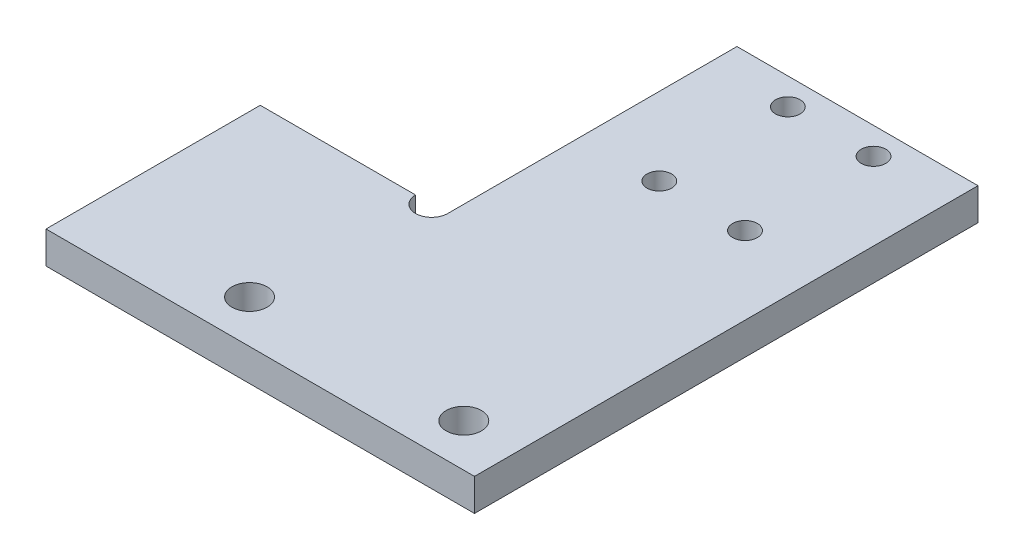
ISO-10303-21;
HEADER;
FILE_DESCRIPTION(('STEP AP214'),'2;1');
FILE_NAME('part.step','',(''),(''),'','','');
FILE_SCHEMA(('AUTOMOTIVE_DESIGN { 1 0 10303 214 1 1 1 1 }'));
ENDSEC;
DATA;
#1=APPLICATION_CONTEXT('core data for automotive mechanical design processes');
#2=APPLICATION_PROTOCOL_DEFINITION('international standard','automotive_design',2000,#1);
#3=PRODUCT_CONTEXT('',#1,'mechanical');
#4=PRODUCT('Part','Part','',(#3));
#5=PRODUCT_RELATED_PRODUCT_CATEGORY('part','',(#4));
#6=PRODUCT_DEFINITION_FORMATION('','',#4);
#7=PRODUCT_DEFINITION_CONTEXT('part definition',#1,'design');
#8=PRODUCT_DEFINITION('design','',#6,#7);
#9=PRODUCT_DEFINITION_SHAPE('','',#8);
#10=(LENGTH_UNIT() NAMED_UNIT(*) SI_UNIT(.MILLI.,.METRE.));
#11=(NAMED_UNIT(*) PLANE_ANGLE_UNIT() SI_UNIT($,.RADIAN.));
#12=(NAMED_UNIT(*) SI_UNIT($,.STERADIAN.) SOLID_ANGLE_UNIT());
#13=UNCERTAINTY_MEASURE_WITH_UNIT(LENGTH_MEASURE(1.E-05),#10,'distance_accuracy_value','');
#14=(GEOMETRIC_REPRESENTATION_CONTEXT(3) GLOBAL_UNCERTAINTY_ASSIGNED_CONTEXT((#13)) GLOBAL_UNIT_ASSIGNED_CONTEXT((#10,
#11,#12)) REPRESENTATION_CONTEXT('',''));
#15=CARTESIAN_POINT('',(0.,0.,0.));
#16=DIRECTION('',(0.,0.,1.));
#17=DIRECTION('',(1.,0.,0.));
#18=AXIS2_PLACEMENT_3D('',#15,#16,#17);
#19=CARTESIAN_POINT('',(11.25,3.,-8.5));
#20=DIRECTION('',(-1.,0.,0.));
#21=DIRECTION('',(0.,0.,1.));
#22=AXIS2_PLACEMENT_3D('',#19,#20,#21);
#23=PLANE('',#22);
#24=DIRECTION('',(0.,0.,-1.));
#25=VECTOR('',#24,1.);
#26=CARTESIAN_POINT('',(11.25,0.,-8.5));
#27=LINE('',#26,#25);
#28=CARTESIAN_POINT('',(11.25,0.,38.5));
#29=VERTEX_POINT('',#28);
#30=CARTESIAN_POINT('',(11.25,0.,-8.5));
#31=VERTEX_POINT('',#30);
#32=EDGE_CURVE('E72',#29,#31,#27,.T.);
#33=ORIENTED_EDGE('',*,*,#32,.T.);
#34=DIRECTION('',(0.,-1.,0.));
#35=VECTOR('',#34,1.);
#36=CARTESIAN_POINT('',(11.25,3.,-8.5));
#37=LINE('',#36,#35);
#38=CARTESIAN_POINT('',(11.25,3.,-8.5));
#39=VERTEX_POINT('',#38);
#40=EDGE_CURVE('E47',#39,#31,#37,.T.);
#41=ORIENTED_EDGE('',*,*,#40,.F.);
#42=DIRECTION('',(0.,0.,-1.));
#43=VECTOR('',#42,1.);
#44=CARTESIAN_POINT('',(11.25,3.,-8.5));
#45=LINE('',#44,#43);
#46=CARTESIAN_POINT('',(11.25,3.,38.5));
#47=VERTEX_POINT('',#46);
#48=EDGE_CURVE('E170',#47,#39,#45,.T.);
#49=ORIENTED_EDGE('',*,*,#48,.F.);
#50=DIRECTION('',(0.,1.,0.));
#51=VECTOR('',#50,1.);
#52=CARTESIAN_POINT('',(11.25,0.,38.5));
#53=LINE('',#52,#51);
#54=EDGE_CURVE('E141',#29,#47,#53,.T.);
#55=ORIENTED_EDGE('',*,*,#54,.F.);
#56=EDGE_LOOP('',(#33,#41,#49,#55));
#57=FACE_BOUND('',#56,.T.);
#58=ADVANCED_FACE('F39',(#57),#23,.F.);
#59=CARTESIAN_POINT('',(-11.25,3.,-8.5));
#60=DIRECTION('',(0.,0.,1.));
#61=DIRECTION('',(1.,0.,0.));
#62=AXIS2_PLACEMENT_3D('',#59,#60,#61);
#63=PLANE('',#62);
#64=DIRECTION('',(-1.,0.,0.));
#65=VECTOR('',#64,1.);
#66=CARTESIAN_POINT('',(-11.25,0.,-8.5));
#67=LINE('',#66,#65);
#68=CARTESIAN_POINT('',(-11.25,0.,-8.5));
#69=VERTEX_POINT('',#68);
#70=EDGE_CURVE('E66',#31,#69,#67,.T.);
#71=ORIENTED_EDGE('',*,*,#70,.T.);
#72=DIRECTION('',(0.,-1.,0.));
#73=VECTOR('',#72,1.);
#74=CARTESIAN_POINT('',(-11.25,3.,-8.5));
#75=LINE('',#74,#73);
#76=CARTESIAN_POINT('',(-11.25,3.,-8.5));
#77=VERTEX_POINT('',#76);
#78=EDGE_CURVE('E176',#77,#69,#75,.T.);
#79=ORIENTED_EDGE('',*,*,#78,.F.);
#80=DIRECTION('',(-1.,0.,0.));
#81=VECTOR('',#80,1.);
#82=CARTESIAN_POINT('',(-11.25,3.,-8.5));
#83=LINE('',#82,#81);
#84=EDGE_CURVE('E55',#39,#77,#83,.T.);
#85=ORIENTED_EDGE('',*,*,#84,.F.);
#86=ORIENTED_EDGE('',*,*,#40,.T.);
#87=EDGE_LOOP('',(#71,#79,#85,#86));
#88=FACE_BOUND('',#87,.T.);
#89=ADVANCED_FACE('F183',(#88),#63,.F.);
#90=CARTESIAN_POINT('',(-11.25,3.,-8.5));
#91=DIRECTION('',(1.,0.,0.));
#92=DIRECTION('',(0.,0.,-1.));
#93=AXIS2_PLACEMENT_3D('',#90,#91,#92);
#94=PLANE('',#93);
#95=DIRECTION('',(0.,0.,1.));
#96=VECTOR('',#95,1.);
#97=CARTESIAN_POINT('',(-11.25,0.,-8.5));
#98=LINE('',#97,#96);
#99=CARTESIAN_POINT('',(-11.25,0.,18.5));
#100=VERTEX_POINT('',#99);
#101=EDGE_CURVE('E172',#69,#100,#98,.T.);
#102=ORIENTED_EDGE('',*,*,#101,.T.);
#103=DIRECTION('',(0.,1.,0.));
#104=VECTOR('',#103,1.);
#105=CARTESIAN_POINT('',(-11.25,0.,18.5));
#106=LINE('',#105,#104);
#107=CARTESIAN_POINT('',(-11.25,3.,18.5));
#108=VERTEX_POINT('',#107);
#109=EDGE_CURVE('E104',#100,#108,#106,.T.);
#110=ORIENTED_EDGE('',*,*,#109,.T.);
#111=DIRECTION('',(0.,0.,1.));
#112=VECTOR('',#111,1.);
#113=CARTESIAN_POINT('',(-11.25,3.,-8.5));
#114=LINE('',#113,#112);
#115=EDGE_CURVE('E174',#77,#108,#114,.T.);
#116=ORIENTED_EDGE('',*,*,#115,.F.);
#117=ORIENTED_EDGE('',*,*,#78,.T.);
#118=EDGE_LOOP('',(#102,#110,#116,#117));
#119=FACE_BOUND('',#118,.T.);
#120=ADVANCED_FACE('F228',(#119),#94,.F.);
#121=CARTESIAN_POINT('',(0.,3.,0.));
#122=DIRECTION('',(0.,1.,0.));
#123=DIRECTION('',(0.,0.,1.));
#124=AXIS2_PLACEMENT_3D('',#121,#122,#123);
#125=PLANE('',#124);
#126=CARTESIAN_POINT('',(-12.75,3.,18.5));
#127=DIRECTION('',(0.,1.,0.));
#128=DIRECTION('',(0.,0.,1.));
#129=AXIS2_PLACEMENT_3D('',#126,#127,#128);
#130=CIRCLE('',#129,1.50000000000001);
#131=CARTESIAN_POINT('',(-14.25,3.,18.5));
#132=VERTEX_POINT('',#131);
#133=EDGE_CURVE('E115',#132,#108,#130,.T.);
#134=ORIENTED_EDGE('',*,*,#133,.F.);
#135=DIRECTION('',(-1.,0.,0.));
#136=VECTOR('',#135,1.);
#137=CARTESIAN_POINT('',(-11.25,3.,18.5));
#138=LINE('',#137,#136);
#139=CARTESIAN_POINT('',(-28.75,3.,18.5));
#140=VERTEX_POINT('',#139);
#141=EDGE_CURVE('E113',#132,#140,#138,.T.);
#142=ORIENTED_EDGE('',*,*,#141,.T.);
#143=DIRECTION('',(0.,0.,1.));
#144=VECTOR('',#143,1.);
#145=CARTESIAN_POINT('',(-28.75,3.,38.5));
#146=LINE('',#145,#144);
#147=CARTESIAN_POINT('',(-28.75,3.,38.5));
#148=VERTEX_POINT('',#147);
#149=EDGE_CURVE('E121',#140,#148,#146,.T.);
#150=ORIENTED_EDGE('',*,*,#149,.T.);
#151=DIRECTION('',(1.,0.,0.));
#152=VECTOR('',#151,1.);
#153=CARTESIAN_POINT('',(11.25,3.,38.5));
#154=LINE('',#153,#152);
#155=EDGE_CURVE('E134',#148,#47,#154,.T.);
#156=ORIENTED_EDGE('',*,*,#155,.T.);
#157=ORIENTED_EDGE('',*,*,#48,.T.);
#158=ORIENTED_EDGE('',*,*,#84,.T.);
#159=ORIENTED_EDGE('',*,*,#115,.T.);
#160=EDGE_LOOP('',(#134,#142,#150,#156,#157,#158,#159));
#161=FACE_BOUND('',#160,.T.);
#162=CARTESIAN_POINT('',(-13.75,3.,34.5));
#163=DIRECTION('',(0.,1.,0.));
#164=DIRECTION('',(0.,0.,1.));
#165=AXIS2_PLACEMENT_3D('',#162,#163,#164);
#166=CIRCLE('',#165,1.65000000000001);
#167=CARTESIAN_POINT('',(-13.75,3.,36.15));
#168=VERTEX_POINT('',#167);
#169=EDGE_CURVE('E114',#168,#168,#166,.T.);
#170=ORIENTED_EDGE('',*,*,#169,.F.);
#171=EDGE_LOOP('',(#170));
#172=FACE_BOUND('',#171,.T.);
#173=CARTESIAN_POINT('',(6.25000000000001,3.,34.5));
#174=DIRECTION('',(0.,1.,0.));
#175=DIRECTION('',(0.,0.,1.));
#176=AXIS2_PLACEMENT_3D('',#173,#174,#175);
#177=CIRCLE('',#176,1.65000000000002);
#178=CARTESIAN_POINT('',(6.25000000000001,3.,36.15));
#179=VERTEX_POINT('',#178);
#180=EDGE_CURVE('E200',#179,#179,#177,.T.);
#181=ORIENTED_EDGE('',*,*,#180,.F.);
#182=EDGE_LOOP('',(#181));
#183=FACE_BOUND('',#182,.T.);
#184=CARTESIAN_POINT('',(-4.,3.,-6.));
#185=DIRECTION('',(0.,1.,0.));
#186=DIRECTION('',(0.,0.,1.));
#187=AXIS2_PLACEMENT_3D('',#184,#185,#186);
#188=CIRCLE('',#187,1.15000000000001);
#189=CARTESIAN_POINT('',(-4.,3.,-4.84999999999999));
#190=VERTEX_POINT('',#189);
#191=EDGE_CURVE('E146',#190,#190,#188,.T.);
#192=ORIENTED_EDGE('',*,*,#191,.F.);
#193=EDGE_LOOP('',(#192));
#194=FACE_BOUND('',#193,.T.);
#195=CARTESIAN_POINT('',(4.,3.,-6.));
#196=DIRECTION('',(0.,1.,0.));
#197=DIRECTION('',(0.,0.,1.));
#198=AXIS2_PLACEMENT_3D('',#195,#196,#197);
#199=CIRCLE('',#198,1.15000000000001);
#200=CARTESIAN_POINT('',(4.,3.,-4.84999999999999));
#201=VERTEX_POINT('',#200);
#202=EDGE_CURVE('E152',#201,#201,#199,.T.);
#203=ORIENTED_EDGE('',*,*,#202,.F.);
#204=EDGE_LOOP('',(#203));
#205=FACE_BOUND('',#204,.T.);
#206=CARTESIAN_POINT('',(-3.99999999999999,3.,6.));
#207=DIRECTION('',(0.,1.,0.));
#208=DIRECTION('',(0.,0.,1.));
#209=AXIS2_PLACEMENT_3D('',#206,#207,#208);
#210=CIRCLE('',#209,1.15000000000001);
#211=CARTESIAN_POINT('',(-3.99999999999999,3.,7.15000000000001));
#212=VERTEX_POINT('',#211);
#213=EDGE_CURVE('E158',#212,#212,#210,.T.);
#214=ORIENTED_EDGE('',*,*,#213,.F.);
#215=EDGE_LOOP('',(#214));
#216=FACE_BOUND('',#215,.T.);
#217=CARTESIAN_POINT('',(4.00000000000001,3.,6.));
#218=DIRECTION('',(0.,1.,0.));
#219=DIRECTION('',(0.,0.,1.));
#220=AXIS2_PLACEMENT_3D('',#217,#218,#219);
#221=CIRCLE('',#220,1.15000000000001);
#222=CARTESIAN_POINT('',(4.00000000000001,3.,7.15000000000001));
#223=VERTEX_POINT('',#222);
#224=EDGE_CURVE('E164',#223,#223,#221,.T.);
#225=ORIENTED_EDGE('',*,*,#224,.F.);
#226=EDGE_LOOP('',(#225));
#227=FACE_BOUND('',#226,.T.);
#228=ADVANCED_FACE('F191',(#161,#172,#183,#194,#205,#216,#227),#125,.T.);
#229=CARTESIAN_POINT('',(0.,0.,0.));
#230=DIRECTION('',(0.,1.,0.));
#231=DIRECTION('',(0.,0.,1.));
#232=AXIS2_PLACEMENT_3D('',#229,#230,#231);
#233=PLANE('',#232);
#234=CARTESIAN_POINT('',(-13.75,0.,34.5));
#235=DIRECTION('',(0.,1.,0.));
#236=DIRECTION('',(0.,0.,1.));
#237=AXIS2_PLACEMENT_3D('',#234,#235,#236);
#238=CIRCLE('',#237,1.65000000000001);
#239=CARTESIAN_POINT('',(-13.75,0.,36.15));
#240=VERTEX_POINT('',#239);
#241=EDGE_CURVE('E198',#240,#240,#238,.T.);
#242=ORIENTED_EDGE('',*,*,#241,.T.);
#243=EDGE_LOOP('',(#242));
#244=FACE_BOUND('',#243,.T.);
#245=CARTESIAN_POINT('',(6.25000000000001,0.,34.5));
#246=DIRECTION('',(0.,1.,0.));
#247=DIRECTION('',(0.,0.,1.));
#248=AXIS2_PLACEMENT_3D('',#245,#246,#247);
#249=CIRCLE('',#248,1.65000000000001);
#250=CARTESIAN_POINT('',(6.25000000000001,0.,36.15));
#251=VERTEX_POINT('',#250);
#252=EDGE_CURVE('E127',#251,#251,#249,.T.);
#253=ORIENTED_EDGE('',*,*,#252,.T.);
#254=EDGE_LOOP('',(#253));
#255=FACE_BOUND('',#254,.T.);
#256=CARTESIAN_POINT('',(-4.,0.,-6.));
#257=DIRECTION('',(0.,1.,0.));
#258=DIRECTION('',(0.,0.,1.));
#259=AXIS2_PLACEMENT_3D('',#256,#257,#258);
#260=CIRCLE('',#259,1.15000000000001);
#261=CARTESIAN_POINT('',(-4.,0.,-4.84999999999999));
#262=VERTEX_POINT('',#261);
#263=EDGE_CURVE('E149',#262,#262,#260,.T.);
#264=ORIENTED_EDGE('',*,*,#263,.T.);
#265=EDGE_LOOP('',(#264));
#266=FACE_BOUND('',#265,.T.);
#267=CARTESIAN_POINT('',(4.,0.,-6.));
#268=DIRECTION('',(0.,1.,0.));
#269=DIRECTION('',(0.,0.,1.));
#270=AXIS2_PLACEMENT_3D('',#267,#268,#269);
#271=CIRCLE('',#270,1.15000000000001);
#272=CARTESIAN_POINT('',(4.,0.,-4.84999999999999));
#273=VERTEX_POINT('',#272);
#274=EDGE_CURVE('E155',#273,#273,#271,.T.);
#275=ORIENTED_EDGE('',*,*,#274,.T.);
#276=EDGE_LOOP('',(#275));
#277=FACE_BOUND('',#276,.T.);
#278=CARTESIAN_POINT('',(-3.99999999999999,0.,6.));
#279=DIRECTION('',(0.,1.,0.));
#280=DIRECTION('',(0.,0.,1.));
#281=AXIS2_PLACEMENT_3D('',#278,#279,#280);
#282=CIRCLE('',#281,1.15000000000001);
#283=CARTESIAN_POINT('',(-3.99999999999999,0.,7.15000000000001));
#284=VERTEX_POINT('',#283);
#285=EDGE_CURVE('E161',#284,#284,#282,.T.);
#286=ORIENTED_EDGE('',*,*,#285,.T.);
#287=EDGE_LOOP('',(#286));
#288=FACE_BOUND('',#287,.T.);
#289=CARTESIAN_POINT('',(4.00000000000001,0.,6.));
#290=DIRECTION('',(0.,1.,0.));
#291=DIRECTION('',(0.,0.,1.));
#292=AXIS2_PLACEMENT_3D('',#289,#290,#291);
#293=CIRCLE('',#292,1.15000000000001);
#294=CARTESIAN_POINT('',(4.00000000000001,0.,7.15000000000001));
#295=VERTEX_POINT('',#294);
#296=EDGE_CURVE('E167',#295,#295,#293,.T.);
#297=ORIENTED_EDGE('',*,*,#296,.T.);
#298=EDGE_LOOP('',(#297));
#299=FACE_BOUND('',#298,.T.);
#300=DIRECTION('',(-1.,0.,0.));
#301=VECTOR('',#300,1.);
#302=CARTESIAN_POINT('',(-11.25,0.,18.5));
#303=LINE('',#302,#301);
#304=CARTESIAN_POINT('',(-14.25,0.,18.5));
#305=VERTEX_POINT('',#304);
#306=CARTESIAN_POINT('',(-28.75,0.,18.5));
#307=VERTEX_POINT('',#306);
#308=EDGE_CURVE('E111',#305,#307,#303,.T.);
#309=ORIENTED_EDGE('',*,*,#308,.F.);
#310=CARTESIAN_POINT('',(-12.75,0.,18.5));
#311=DIRECTION('',(0.,1.,0.));
#312=DIRECTION('',(0.,0.,1.));
#313=AXIS2_PLACEMENT_3D('',#310,#311,#312);
#314=CIRCLE('',#313,1.50000000000001);
#315=EDGE_CURVE('E11',#305,#100,#314,.T.);
#316=ORIENTED_EDGE('',*,*,#315,.T.);
#317=ORIENTED_EDGE('',*,*,#101,.F.);
#318=ORIENTED_EDGE('',*,*,#70,.F.);
#319=ORIENTED_EDGE('',*,*,#32,.F.);
#320=DIRECTION('',(1.,0.,0.));
#321=VECTOR('',#320,1.);
#322=CARTESIAN_POINT('',(11.25,0.,38.5));
#323=LINE('',#322,#321);
#324=CARTESIAN_POINT('',(-28.75,0.,38.5));
#325=VERTEX_POINT('',#324);
#326=EDGE_CURVE('E138',#325,#29,#323,.T.);
#327=ORIENTED_EDGE('',*,*,#326,.F.);
#328=DIRECTION('',(0.,0.,1.));
#329=VECTOR('',#328,1.);
#330=CARTESIAN_POINT('',(-28.75,0.,38.5));
#331=LINE('',#330,#329);
#332=EDGE_CURVE('E120',#307,#325,#331,.T.);
#333=ORIENTED_EDGE('',*,*,#332,.F.);
#334=EDGE_LOOP('',(#309,#316,#317,#318,#319,#327,#333));
#335=FACE_BOUND('',#334,.T.);
#336=ADVANCED_FACE('F118',(#244,#255,#266,#277,#288,#299,#335),#233,.F.);
#337=CARTESIAN_POINT('',(4.00000000000001,3.,6.));
#338=DIRECTION('',(0.,1.,0.));
#339=DIRECTION('',(0.,0.,1.));
#340=AXIS2_PLACEMENT_3D('',#337,#338,#339);
#341=CYLINDRICAL_SURFACE('',#340,1.15000000000001);
#342=ORIENTED_EDGE('',*,*,#296,.F.);
#343=EDGE_LOOP('',(#342));
#344=FACE_BOUND('',#343,.T.);
#345=ORIENTED_EDGE('',*,*,#224,.T.);
#346=EDGE_LOOP('',(#345));
#347=FACE_BOUND('',#346,.T.);
#348=ADVANCED_FACE('F238',(#344,#347),#341,.F.);
#349=CARTESIAN_POINT('',(-3.99999999999999,3.,6.));
#350=DIRECTION('',(0.,1.,0.));
#351=DIRECTION('',(0.,0.,1.));
#352=AXIS2_PLACEMENT_3D('',#349,#350,#351);
#353=CYLINDRICAL_SURFACE('',#352,1.15000000000001);
#354=ORIENTED_EDGE('',*,*,#285,.F.);
#355=EDGE_LOOP('',(#354));
#356=FACE_BOUND('',#355,.T.);
#357=ORIENTED_EDGE('',*,*,#213,.T.);
#358=EDGE_LOOP('',(#357));
#359=FACE_BOUND('',#358,.T.);
#360=ADVANCED_FACE('F243',(#356,#359),#353,.F.);
#361=CARTESIAN_POINT('',(4.,3.,-6.));
#362=DIRECTION('',(0.,1.,0.));
#363=DIRECTION('',(0.,0.,1.));
#364=AXIS2_PLACEMENT_3D('',#361,#362,#363);
#365=CYLINDRICAL_SURFACE('',#364,1.15000000000001);
#366=ORIENTED_EDGE('',*,*,#274,.F.);
#367=EDGE_LOOP('',(#366));
#368=FACE_BOUND('',#367,.T.);
#369=ORIENTED_EDGE('',*,*,#202,.T.);
#370=EDGE_LOOP('',(#369));
#371=FACE_BOUND('',#370,.T.);
#372=ADVANCED_FACE('F247',(#368,#371),#365,.F.);
#373=CARTESIAN_POINT('',(-4.,3.,-6.));
#374=DIRECTION('',(0.,1.,0.));
#375=DIRECTION('',(0.,0.,1.));
#376=AXIS2_PLACEMENT_3D('',#373,#374,#375);
#377=CYLINDRICAL_SURFACE('',#376,1.15000000000001);
#378=ORIENTED_EDGE('',*,*,#263,.F.);
#379=EDGE_LOOP('',(#378));
#380=FACE_BOUND('',#379,.T.);
#381=ORIENTED_EDGE('',*,*,#191,.T.);
#382=EDGE_LOOP('',(#381));
#383=FACE_BOUND('',#382,.T.);
#384=ADVANCED_FACE('F251',(#380,#383),#377,.F.);
#385=CARTESIAN_POINT('',(11.25,0.,38.5));
#386=DIRECTION('',(0.,0.,1.));
#387=DIRECTION('',(1.,0.,0.));
#388=AXIS2_PLACEMENT_3D('',#385,#386,#387);
#389=PLANE('',#388);
#390=ORIENTED_EDGE('',*,*,#155,.F.);
#391=DIRECTION('',(0.,1.,0.));
#392=VECTOR('',#391,1.);
#393=CARTESIAN_POINT('',(-28.75,0.,38.5));
#394=LINE('',#393,#392);
#395=EDGE_CURVE('E131',#325,#148,#394,.T.);
#396=ORIENTED_EDGE('',*,*,#395,.F.);
#397=ORIENTED_EDGE('',*,*,#326,.T.);
#398=ORIENTED_EDGE('',*,*,#54,.T.);
#399=EDGE_LOOP('',(#390,#396,#397,#398));
#400=FACE_BOUND('',#399,.T.);
#401=ADVANCED_FACE('F187',(#400),#389,.T.);
#402=CARTESIAN_POINT('',(-28.75,0.,38.5));
#403=DIRECTION('',(-1.,0.,0.));
#404=DIRECTION('',(0.,0.,1.));
#405=AXIS2_PLACEMENT_3D('',#402,#403,#404);
#406=PLANE('',#405);
#407=ORIENTED_EDGE('',*,*,#149,.F.);
#408=DIRECTION('',(0.,1.,0.));
#409=VECTOR('',#408,1.);
#410=CARTESIAN_POINT('',(-28.75,0.,18.5));
#411=LINE('',#410,#409);
#412=EDGE_CURVE('E135',#307,#140,#411,.T.);
#413=ORIENTED_EDGE('',*,*,#412,.F.);
#414=ORIENTED_EDGE('',*,*,#332,.T.);
#415=ORIENTED_EDGE('',*,*,#395,.T.);
#416=EDGE_LOOP('',(#407,#413,#414,#415));
#417=FACE_BOUND('',#416,.T.);
#418=ADVANCED_FACE('F190',(#417),#406,.T.);
#419=CARTESIAN_POINT('',(-11.25,0.,18.5));
#420=DIRECTION('',(0.,0.,-1.));
#421=DIRECTION('',(-1.,0.,0.));
#422=AXIS2_PLACEMENT_3D('',#419,#420,#421);
#423=PLANE('',#422);
#424=DIRECTION('',(0.,1.,0.));
#425=VECTOR('',#424,1.);
#426=CARTESIAN_POINT('',(-14.25,3.,18.5));
#427=LINE('',#426,#425);
#428=EDGE_CURVE('E101',#305,#132,#427,.T.);
#429=ORIENTED_EDGE('',*,*,#428,.F.);
#430=ORIENTED_EDGE('',*,*,#308,.T.);
#431=ORIENTED_EDGE('',*,*,#412,.T.);
#432=ORIENTED_EDGE('',*,*,#141,.F.);
#433=EDGE_LOOP('',(#429,#430,#431,#432));
#434=FACE_BOUND('',#433,.T.);
#435=ADVANCED_FACE('F109',(#434),#423,.T.);
#436=CARTESIAN_POINT('',(6.25000000000001,3.,34.5));
#437=DIRECTION('',(0.,1.,0.));
#438=DIRECTION('',(0.,0.,1.));
#439=AXIS2_PLACEMENT_3D('',#436,#437,#438);
#440=CYLINDRICAL_SURFACE('',#439,1.65000000000001);
#441=ORIENTED_EDGE('',*,*,#252,.F.);
#442=EDGE_LOOP('',(#441));
#443=FACE_BOUND('',#442,.T.);
#444=ORIENTED_EDGE('',*,*,#180,.T.);
#445=EDGE_LOOP('',(#444));
#446=FACE_BOUND('',#445,.T.);
#447=ADVANCED_FACE('F209',(#443,#446),#440,.F.);
#448=CARTESIAN_POINT('',(-13.75,3.,34.5));
#449=DIRECTION('',(0.,1.,0.));
#450=DIRECTION('',(0.,0.,1.));
#451=AXIS2_PLACEMENT_3D('',#448,#449,#450);
#452=CYLINDRICAL_SURFACE('',#451,1.65000000000001);
#453=ORIENTED_EDGE('',*,*,#241,.F.);
#454=EDGE_LOOP('',(#453));
#455=FACE_BOUND('',#454,.T.);
#456=ORIENTED_EDGE('',*,*,#169,.T.);
#457=EDGE_LOOP('',(#456));
#458=FACE_BOUND('',#457,.T.);
#459=ADVANCED_FACE('F211',(#455,#458),#452,.F.);
#460=CARTESIAN_POINT('',(-12.75,3.,18.5));
#461=DIRECTION('',(0.,1.,0.));
#462=DIRECTION('',(0.,0.,1.));
#463=AXIS2_PLACEMENT_3D('',#460,#461,#462);
#464=CYLINDRICAL_SURFACE('',#463,1.50000000000001);
#465=ORIENTED_EDGE('',*,*,#428,.T.);
#466=ORIENTED_EDGE('',*,*,#133,.T.);
#467=ORIENTED_EDGE('',*,*,#109,.F.);
#468=ORIENTED_EDGE('',*,*,#315,.F.);
#469=EDGE_LOOP('',(#465,#466,#467,#468));
#470=FACE_BOUND('',#469,.T.);
#471=ADVANCED_FACE('F100',(#470),#464,.F.);
#472=CLOSED_SHELL('',(#58,#89,#120,#228,#336,#348,#360,#372,#384,#401,#418,#435,#447,#459,#471));
#473=MANIFOLD_SOLID_BREP('B2',#472);
#474=ADVANCED_BREP_SHAPE_REPRESENTATION('',(#18,#473),#14);
#475=SHAPE_DEFINITION_REPRESENTATION(#9,#474);
ENDSEC;
END-ISO-10303-21;
